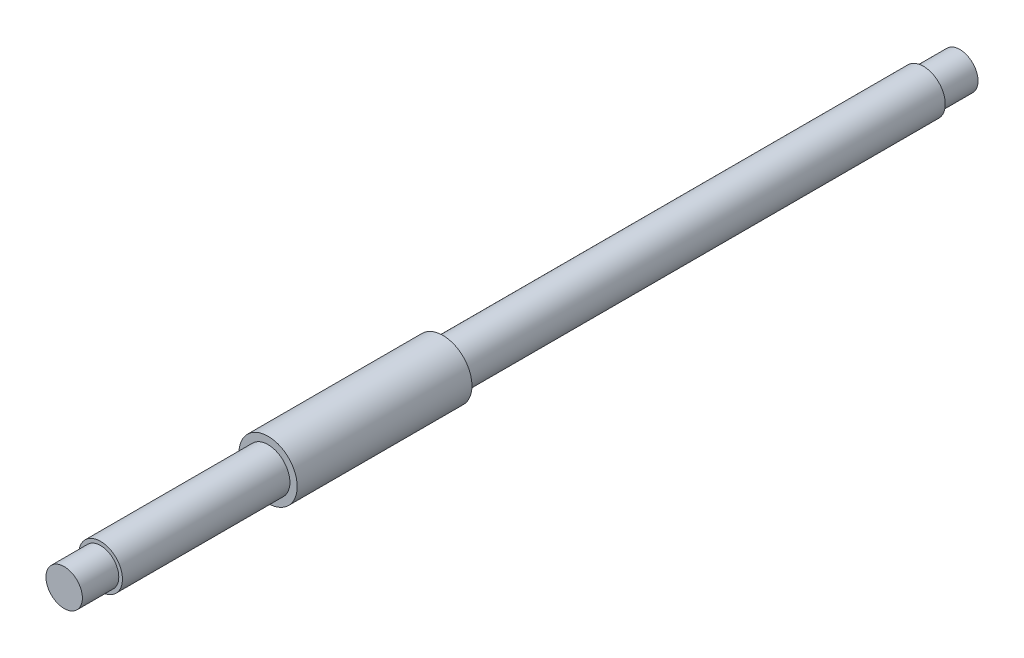
ISO-10303-21;
HEADER;
FILE_DESCRIPTION(('STEP AP214'),'2;1');
FILE_NAME('part.step','',(''),(''),'','','');
FILE_SCHEMA(('AUTOMOTIVE_DESIGN { 1 0 10303 214 1 1 1 1 }'));
ENDSEC;
DATA;
#1=APPLICATION_CONTEXT('core data for automotive mechanical design processes');
#2=APPLICATION_PROTOCOL_DEFINITION('international standard','automotive_design',2000,#1);
#3=PRODUCT_CONTEXT('',#1,'mechanical');
#4=PRODUCT('Part','Part','',(#3));
#5=PRODUCT_RELATED_PRODUCT_CATEGORY('part','',(#4));
#6=PRODUCT_DEFINITION_FORMATION('','',#4);
#7=PRODUCT_DEFINITION_CONTEXT('part definition',#1,'design');
#8=PRODUCT_DEFINITION('design','',#6,#7);
#9=PRODUCT_DEFINITION_SHAPE('','',#8);
#10=(LENGTH_UNIT() NAMED_UNIT(*) SI_UNIT(.MILLI.,.METRE.));
#11=(NAMED_UNIT(*) PLANE_ANGLE_UNIT() SI_UNIT($,.RADIAN.));
#12=(NAMED_UNIT(*) SI_UNIT($,.STERADIAN.) SOLID_ANGLE_UNIT());
#13=UNCERTAINTY_MEASURE_WITH_UNIT(LENGTH_MEASURE(1.E-05),#10,'distance_accuracy_value','');
#14=(GEOMETRIC_REPRESENTATION_CONTEXT(3) GLOBAL_UNCERTAINTY_ASSIGNED_CONTEXT((#13)) GLOBAL_UNIT_ASSIGNED_CONTEXT((#10,
#11,#12)) REPRESENTATION_CONTEXT('',''));
#15=CARTESIAN_POINT('',(0.,0.,0.));
#16=DIRECTION('',(0.,0.,1.));
#17=DIRECTION('',(1.,0.,0.));
#18=AXIS2_PLACEMENT_3D('',#15,#16,#17);
#19=CARTESIAN_POINT('',(0.,0.,24.));
#20=DIRECTION('',(0.,0.,-1.));
#21=DIRECTION('',(-1.,0.,0.));
#22=AXIS2_PLACEMENT_3D('',#19,#20,#21);
#23=CYLINDRICAL_SURFACE('',#22,4.);
#24=CARTESIAN_POINT('',(0.,0.,24.));
#25=DIRECTION('',(0.,0.,1.));
#26=DIRECTION('',(1.,0.,0.));
#27=AXIS2_PLACEMENT_3D('',#24,#25,#26);
#28=CIRCLE('',#27,4.);
#29=CARTESIAN_POINT('',(4.,0.,24.));
#30=VERTEX_POINT('',#29);
#31=EDGE_CURVE('E65',#30,#30,#28,.T.);
#32=ORIENTED_EDGE('',*,*,#31,.F.);
#33=EDGE_LOOP('',(#32));
#34=FACE_BOUND('',#33,.T.);
#35=CARTESIAN_POINT('',(0.,0.,0.));
#36=DIRECTION('',(0.,0.,1.));
#37=DIRECTION('',(1.,0.,0.));
#38=AXIS2_PLACEMENT_3D('',#35,#36,#37);
#39=CIRCLE('',#38,4.);
#40=CARTESIAN_POINT('',(4.,0.,0.));
#41=VERTEX_POINT('',#40);
#42=EDGE_CURVE('E38',#41,#41,#39,.T.);
#43=ORIENTED_EDGE('',*,*,#42,.T.);
#44=EDGE_LOOP('',(#43));
#45=FACE_BOUND('',#44,.T.);
#46=ADVANCED_FACE('F35',(#34,#45),#23,.T.);
#47=CARTESIAN_POINT('',(0.,0.,24.));
#48=DIRECTION('',(0.,0.,1.));
#49=DIRECTION('',(1.,0.,0.));
#50=AXIS2_PLACEMENT_3D('',#47,#48,#49);
#51=PLANE('',#50);
#52=CARTESIAN_POINT('',(0.,0.,24.));
#53=DIRECTION('',(0.,0.,1.));
#54=DIRECTION('',(1.,0.,0.));
#55=AXIS2_PLACEMENT_3D('',#52,#53,#54);
#56=CIRCLE('',#55,3.);
#57=CARTESIAN_POINT('',(3.,0.,24.));
#58=VERTEX_POINT('',#57);
#59=EDGE_CURVE('E61',#58,#58,#56,.T.);
#60=ORIENTED_EDGE('',*,*,#59,.F.);
#61=EDGE_LOOP('',(#60));
#62=FACE_BOUND('',#61,.T.);
#63=ORIENTED_EDGE('',*,*,#31,.T.);
#64=EDGE_LOOP('',(#63));
#65=FACE_BOUND('',#64,.T.);
#66=ADVANCED_FACE('F76',(#62,#65),#51,.T.);
#67=CARTESIAN_POINT('',(0.,0.,0.));
#68=DIRECTION('',(0.,0.,1.));
#69=DIRECTION('',(1.,0.,0.));
#70=AXIS2_PLACEMENT_3D('',#67,#68,#69);
#71=PLANE('',#70);
#72=CARTESIAN_POINT('',(0.,0.,0.));
#73=DIRECTION('',(0.,0.,-1.));
#74=DIRECTION('',(-1.,0.,0.));
#75=AXIS2_PLACEMENT_3D('',#72,#73,#74);
#76=CIRCLE('',#75,3.);
#77=CARTESIAN_POINT('',(-3.,0.,0.));
#78=VERTEX_POINT('',#77);
#79=EDGE_CURVE('E47',#78,#78,#76,.T.);
#80=ORIENTED_EDGE('',*,*,#79,.F.);
#81=EDGE_LOOP('',(#80));
#82=FACE_BOUND('',#81,.T.);
#83=ORIENTED_EDGE('',*,*,#42,.F.);
#84=EDGE_LOOP('',(#83));
#85=FACE_BOUND('',#84,.T.);
#86=ADVANCED_FACE('F73',(#82,#85),#71,.F.);
#87=CARTESIAN_POINT('',(0.,0.,47.));
#88=DIRECTION('',(0.,0.,-1.));
#89=DIRECTION('',(-1.,0.,0.));
#90=AXIS2_PLACEMENT_3D('',#87,#88,#89);
#91=CYLINDRICAL_SURFACE('',#90,3.);
#92=CARTESIAN_POINT('',(0.,0.,47.));
#93=DIRECTION('',(0.,0.,1.));
#94=DIRECTION('',(1.,0.,0.));
#95=AXIS2_PLACEMENT_3D('',#92,#93,#94);
#96=CIRCLE('',#95,3.);
#97=CARTESIAN_POINT('',(3.,0.,47.));
#98=VERTEX_POINT('',#97);
#99=EDGE_CURVE('E58',#98,#98,#96,.T.);
#100=ORIENTED_EDGE('',*,*,#99,.F.);
#101=EDGE_LOOP('',(#100));
#102=FACE_BOUND('',#101,.T.);
#103=ORIENTED_EDGE('',*,*,#59,.T.);
#104=EDGE_LOOP('',(#103));
#105=FACE_BOUND('',#104,.T.);
#106=ADVANCED_FACE('F75',(#102,#105),#91,.T.);
#107=CARTESIAN_POINT('',(0.,0.,47.));
#108=DIRECTION('',(0.,0.,1.));
#109=DIRECTION('',(1.,0.,0.));
#110=AXIS2_PLACEMENT_3D('',#107,#108,#109);
#111=PLANE('',#110);
#112=CARTESIAN_POINT('',(0.,0.,47.));
#113=DIRECTION('',(0.,0.,1.));
#114=DIRECTION('',(1.,0.,0.));
#115=AXIS2_PLACEMENT_3D('',#112,#113,#114);
#116=CIRCLE('',#115,2.5);
#117=CARTESIAN_POINT('',(2.5,0.,47.));
#118=VERTEX_POINT('',#117);
#119=EDGE_CURVE('E10',#118,#118,#116,.T.);
#120=ORIENTED_EDGE('',*,*,#119,.F.);
#121=EDGE_LOOP('',(#120));
#122=FACE_BOUND('',#121,.T.);
#123=ORIENTED_EDGE('',*,*,#99,.T.);
#124=EDGE_LOOP('',(#123));
#125=FACE_BOUND('',#124,.T.);
#126=ADVANCED_FACE('F82',(#122,#125),#111,.T.);
#127=CARTESIAN_POINT('',(0.,0.,-66.));
#128=DIRECTION('',(0.,0.,1.));
#129=DIRECTION('',(1.,0.,0.));
#130=AXIS2_PLACEMENT_3D('',#127,#128,#129);
#131=CYLINDRICAL_SURFACE('',#130,3.);
#132=CARTESIAN_POINT('',(0.,0.,-66.));
#133=DIRECTION('',(0.,0.,-1.));
#134=DIRECTION('',(-1.,0.,0.));
#135=AXIS2_PLACEMENT_3D('',#132,#133,#134);
#136=CIRCLE('',#135,3.);
#137=CARTESIAN_POINT('',(-3.,0.,-66.));
#138=VERTEX_POINT('',#137);
#139=EDGE_CURVE('E54',#138,#138,#136,.T.);
#140=ORIENTED_EDGE('',*,*,#139,.F.);
#141=EDGE_LOOP('',(#140));
#142=FACE_BOUND('',#141,.T.);
#143=ORIENTED_EDGE('',*,*,#79,.T.);
#144=EDGE_LOOP('',(#143));
#145=FACE_BOUND('',#144,.T.);
#146=ADVANCED_FACE('F116',(#142,#145),#131,.T.);
#147=CARTESIAN_POINT('',(0.,0.,-66.));
#148=DIRECTION('',(0.,0.,-1.));
#149=DIRECTION('',(-1.,0.,0.));
#150=AXIS2_PLACEMENT_3D('',#147,#148,#149);
#151=PLANE('',#150);
#152=CARTESIAN_POINT('',(0.,0.,-66.));
#153=DIRECTION('',(0.,0.,-1.));
#154=DIRECTION('',(-1.,0.,0.));
#155=AXIS2_PLACEMENT_3D('',#152,#153,#154);
#156=CIRCLE('',#155,2.5);
#157=CARTESIAN_POINT('',(-2.5,0.,-66.));
#158=VERTEX_POINT('',#157);
#159=EDGE_CURVE('E42',#158,#158,#156,.T.);
#160=ORIENTED_EDGE('',*,*,#159,.F.);
#161=EDGE_LOOP('',(#160));
#162=FACE_BOUND('',#161,.T.);
#163=ORIENTED_EDGE('',*,*,#139,.T.);
#164=EDGE_LOOP('',(#163));
#165=FACE_BOUND('',#164,.T.);
#166=ADVANCED_FACE('F121',(#162,#165),#151,.T.);
#167=CARTESIAN_POINT('',(0.,0.,-71.));
#168=DIRECTION('',(0.,0.,1.));
#169=DIRECTION('',(1.,0.,0.));
#170=AXIS2_PLACEMENT_3D('',#167,#168,#169);
#171=CYLINDRICAL_SURFACE('',#170,2.5);
#172=CARTESIAN_POINT('',(0.,0.,-71.));
#173=DIRECTION('',(0.,0.,-1.));
#174=DIRECTION('',(-1.,0.,0.));
#175=AXIS2_PLACEMENT_3D('',#172,#173,#174);
#176=CIRCLE('',#175,2.5);
#177=CARTESIAN_POINT('',(-2.5,0.,-71.));
#178=VERTEX_POINT('',#177);
#179=EDGE_CURVE('E52',#178,#178,#176,.T.);
#180=ORIENTED_EDGE('',*,*,#179,.F.);
#181=EDGE_LOOP('',(#180));
#182=FACE_BOUND('',#181,.T.);
#183=ORIENTED_EDGE('',*,*,#159,.T.);
#184=EDGE_LOOP('',(#183));
#185=FACE_BOUND('',#184,.T.);
#186=ADVANCED_FACE('F132',(#182,#185),#171,.T.);
#187=CARTESIAN_POINT('',(0.,0.,-71.));
#188=DIRECTION('',(0.,0.,-1.));
#189=DIRECTION('',(-1.,0.,0.));
#190=AXIS2_PLACEMENT_3D('',#187,#188,#189);
#191=PLANE('',#190);
#192=ORIENTED_EDGE('',*,*,#179,.T.);
#193=EDGE_LOOP('',(#192));
#194=FACE_BOUND('',#193,.T.);
#195=ADVANCED_FACE('F143',(#194),#191,.T.);
#196=CARTESIAN_POINT('',(0.,0.,52.));
#197=DIRECTION('',(0.,0.,-1.));
#198=DIRECTION('',(-1.,0.,0.));
#199=AXIS2_PLACEMENT_3D('',#196,#197,#198);
#200=CYLINDRICAL_SURFACE('',#199,2.5);
#201=CARTESIAN_POINT('',(0.,0.,52.));
#202=DIRECTION('',(0.,0.,1.));
#203=DIRECTION('',(1.,0.,0.));
#204=AXIS2_PLACEMENT_3D('',#201,#202,#203);
#205=CIRCLE('',#204,2.5);
#206=CARTESIAN_POINT('',(2.5,0.,52.));
#207=VERTEX_POINT('',#206);
#208=EDGE_CURVE('E51',#207,#207,#205,.T.);
#209=ORIENTED_EDGE('',*,*,#208,.F.);
#210=EDGE_LOOP('',(#209));
#211=FACE_BOUND('',#210,.T.);
#212=ORIENTED_EDGE('',*,*,#119,.T.);
#213=EDGE_LOOP('',(#212));
#214=FACE_BOUND('',#213,.T.);
#215=ADVANCED_FACE('F154',(#211,#214),#200,.T.);
#216=CARTESIAN_POINT('',(0.,0.,52.));
#217=DIRECTION('',(0.,0.,1.));
#218=DIRECTION('',(1.,0.,0.));
#219=AXIS2_PLACEMENT_3D('',#216,#217,#218);
#220=PLANE('',#219);
#221=ORIENTED_EDGE('',*,*,#208,.T.);
#222=EDGE_LOOP('',(#221));
#223=FACE_BOUND('',#222,.T.);
#224=ADVANCED_FACE('F173',(#223),#220,.T.);
#225=CLOSED_SHELL('',(#46,#66,#86,#106,#126,#146,#166,#186,#195,#215,#224));
#226=MANIFOLD_SOLID_BREP('B2',#225);
#227=ADVANCED_BREP_SHAPE_REPRESENTATION('',(#18,#226),#14);
#228=SHAPE_DEFINITION_REPRESENTATION(#9,#227);
ENDSEC;
END-ISO-10303-21;
